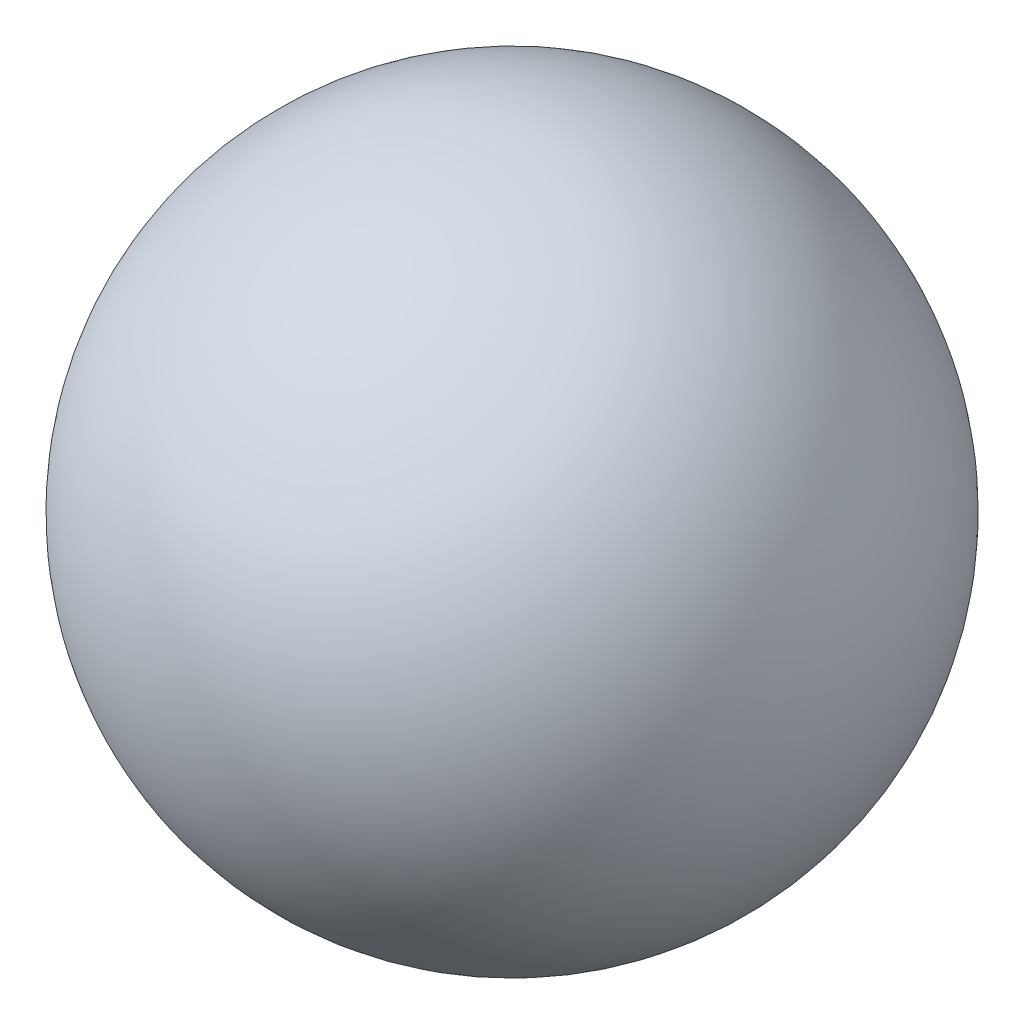
ISO-10303-21;
HEADER;
FILE_DESCRIPTION(('STEP AP214'),'2;1');
FILE_NAME('part.step','',(''),(''),'','','');
FILE_SCHEMA(('AUTOMOTIVE_DESIGN { 1 0 10303 214 1 1 1 1 }'));
ENDSEC;
DATA;
#1=APPLICATION_CONTEXT('core data for automotive mechanical design processes');
#2=APPLICATION_PROTOCOL_DEFINITION('international standard','automotive_design',2000,#1);
#3=PRODUCT_CONTEXT('',#1,'mechanical');
#4=PRODUCT('Part','Part','',(#3));
#5=PRODUCT_RELATED_PRODUCT_CATEGORY('part','',(#4));
#6=PRODUCT_DEFINITION_FORMATION('','',#4);
#7=PRODUCT_DEFINITION_CONTEXT('part definition',#1,'design');
#8=PRODUCT_DEFINITION('design','',#6,#7);
#9=PRODUCT_DEFINITION_SHAPE('','',#8);
#10=(LENGTH_UNIT() NAMED_UNIT(*) SI_UNIT(.MILLI.,.METRE.));
#11=(NAMED_UNIT(*) PLANE_ANGLE_UNIT() SI_UNIT($,.RADIAN.));
#12=(NAMED_UNIT(*) SI_UNIT($,.STERADIAN.) SOLID_ANGLE_UNIT());
#13=UNCERTAINTY_MEASURE_WITH_UNIT(LENGTH_MEASURE(1.E-05),#10,'distance_accuracy_value','');
#14=(GEOMETRIC_REPRESENTATION_CONTEXT(3) GLOBAL_UNCERTAINTY_ASSIGNED_CONTEXT((#13)) GLOBAL_UNIT_ASSIGNED_CONTEXT((#10,
#11,#12)) REPRESENTATION_CONTEXT('',''));
#15=CARTESIAN_POINT('',(0.,0.,0.));
#16=DIRECTION('',(0.,0.,1.));
#17=DIRECTION('',(1.,0.,0.));
#18=AXIS2_PLACEMENT_3D('',#15,#16,#17);
#19=CARTESIAN_POINT('',(5.,37.5,0.));
#20=DIRECTION('',(0.,0.,1.));
#21=DIRECTION('',(-1.,0.,0.));
#22=AXIS2_PLACEMENT_3D('',#19,#20,#21);
#23=SPHERICAL_SURFACE('',#22,2.778);
#24=CARTESIAN_POINT('',(5.,37.5,2.778));
#25=VERTEX_POINT('',#24);
#26=VERTEX_LOOP('',#25);
#27=FACE_BOUND('',#26,.T.);
#28=ADVANCED_FACE('F30',(#27),#23,.T.);
#29=CLOSED_SHELL('',(#28));
#30=MANIFOLD_SOLID_BREP('B2',#29);
#31=ADVANCED_BREP_SHAPE_REPRESENTATION('',(#18,#30),#14);
#32=SHAPE_DEFINITION_REPRESENTATION(#9,#31);
ENDSEC;
END-ISO-10303-21;
